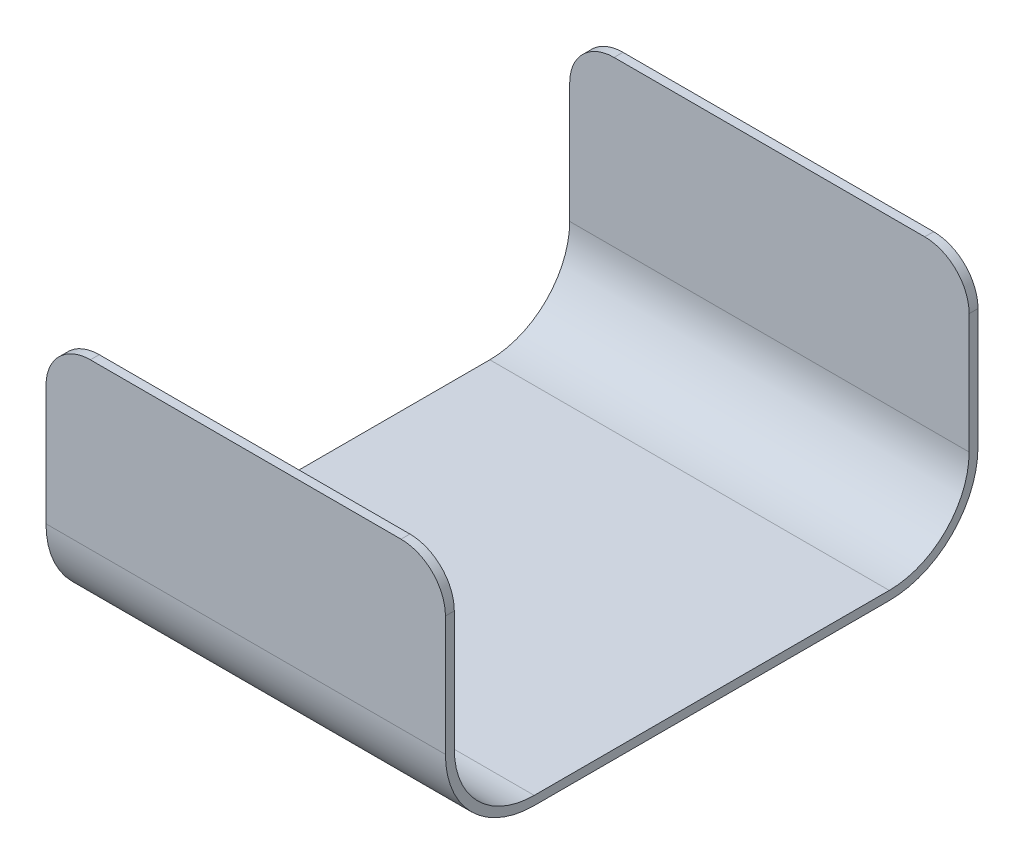
ISO-10303-21;
HEADER;
FILE_DESCRIPTION(('STEP AP214'),'2;1');
FILE_NAME('part.step','',(''),(''),'','','');
FILE_SCHEMA(('AUTOMOTIVE_DESIGN { 1 0 10303 214 1 1 1 1 }'));
ENDSEC;
DATA;
#1=APPLICATION_CONTEXT('core data for automotive mechanical design processes');
#2=APPLICATION_PROTOCOL_DEFINITION('international standard','automotive_design',2000,#1);
#3=PRODUCT_CONTEXT('',#1,'mechanical');
#4=PRODUCT('Part','Part','',(#3));
#5=PRODUCT_RELATED_PRODUCT_CATEGORY('part','',(#4));
#6=PRODUCT_DEFINITION_FORMATION('','',#4);
#7=PRODUCT_DEFINITION_CONTEXT('part definition',#1,'design');
#8=PRODUCT_DEFINITION('design','',#6,#7);
#9=PRODUCT_DEFINITION_SHAPE('','',#8);
#10=(LENGTH_UNIT() NAMED_UNIT(*) SI_UNIT(.MILLI.,.METRE.));
#11=(NAMED_UNIT(*) PLANE_ANGLE_UNIT() SI_UNIT($,.RADIAN.));
#12=(NAMED_UNIT(*) SI_UNIT($,.STERADIAN.) SOLID_ANGLE_UNIT());
#13=UNCERTAINTY_MEASURE_WITH_UNIT(LENGTH_MEASURE(1.E-05),#10,'distance_accuracy_value','');
#14=(GEOMETRIC_REPRESENTATION_CONTEXT(3) GLOBAL_UNCERTAINTY_ASSIGNED_CONTEXT((#13)) GLOBAL_UNIT_ASSIGNED_CONTEXT((#10,
#11,#12)) REPRESENTATION_CONTEXT('',''));
#15=CARTESIAN_POINT('',(0.,0.,0.));
#16=DIRECTION('',(0.,0.,1.));
#17=DIRECTION('',(1.,0.,0.));
#18=AXIS2_PLACEMENT_3D('',#15,#16,#17);
#19=CARTESIAN_POINT('',(-45.,28.5,60.));
#20=DIRECTION('',(0.,-1.,0.));
#21=DIRECTION('',(0.,0.,-1.));
#22=AXIS2_PLACEMENT_3D('',#19,#20,#21);
#23=PLANE('',#22);
#24=DIRECTION('',(-1.,0.,0.));
#25=VECTOR('',#24,1.);
#26=CARTESIAN_POINT('',(0.,28.5,-58.));
#27=LINE('',#26,#25);
#28=CARTESIAN_POINT('',(35.,28.5,-58.));
#29=VERTEX_POINT('',#28);
#30=CARTESIAN_POINT('',(-35.,28.5,-58.));
#31=VERTEX_POINT('',#30);
#32=EDGE_CURVE('E194',#29,#31,#27,.T.);
#33=ORIENTED_EDGE('',*,*,#32,.F.);
#34=DIRECTION('',(0.,0.,-1.));
#35=VECTOR('',#34,1.);
#36=CARTESIAN_POINT('',(35.,28.5,60.));
#37=LINE('',#36,#35);
#38=CARTESIAN_POINT('',(35.,28.5,-60.));
#39=VERTEX_POINT('',#38);
#40=EDGE_CURVE('E240',#29,#39,#37,.T.);
#41=ORIENTED_EDGE('',*,*,#40,.T.);
#42=DIRECTION('',(-1.,0.,0.));
#43=VECTOR('',#42,1.);
#44=CARTESIAN_POINT('',(-45.,28.5,-60.));
#45=LINE('',#44,#43);
#46=CARTESIAN_POINT('',(-35.,28.5,-60.));
#47=VERTEX_POINT('',#46);
#48=EDGE_CURVE('E209',#39,#47,#45,.T.);
#49=ORIENTED_EDGE('',*,*,#48,.T.);
#50=DIRECTION('',(0.,0.,-1.));
#51=VECTOR('',#50,1.);
#52=CARTESIAN_POINT('',(-35.,28.5,60.));
#53=LINE('',#52,#51);
#54=EDGE_CURVE('E238',#47,#31,#53,.F.);
#55=ORIENTED_EDGE('',*,*,#54,.T.);
#56=EDGE_LOOP('',(#33,#41,#49,#55));
#57=FACE_BOUND('',#56,.T.);
#58=ADVANCED_FACE('F32',(#57),#23,.F.);
#59=CARTESIAN_POINT('',(-45.,-28.5,60.));
#60=DIRECTION('',(1.,0.,0.));
#61=DIRECTION('',(0.,0.,-1.));
#62=AXIS2_PLACEMENT_3D('',#59,#60,#61);
#63=PLANE('',#62);
#64=DIRECTION('',(0.,-1.,0.));
#65=VECTOR('',#64,1.);
#66=CARTESIAN_POINT('',(-45.,0.,-58.));
#67=LINE('',#66,#65);
#68=CARTESIAN_POINT('',(-45.,18.5,-58.));
#69=VERTEX_POINT('',#68);
#70=CARTESIAN_POINT('',(-45.,-8.50000000000001,-58.));
#71=VERTEX_POINT('',#70);
#72=EDGE_CURVE('E187',#69,#71,#67,.T.);
#73=ORIENTED_EDGE('',*,*,#72,.F.);
#74=DIRECTION('',(0.,0.,-1.));
#75=VECTOR('',#74,1.);
#76=CARTESIAN_POINT('',(-45.,18.5,60.));
#77=LINE('',#76,#75);
#78=CARTESIAN_POINT('',(-45.,18.5,-60.));
#79=VERTEX_POINT('',#78);
#80=EDGE_CURVE('E257',#69,#79,#77,.T.);
#81=ORIENTED_EDGE('',*,*,#80,.T.);
#82=DIRECTION('',(0.,-1.,0.));
#83=VECTOR('',#82,1.);
#84=CARTESIAN_POINT('',(-45.,-28.5,-60.));
#85=LINE('',#84,#83);
#86=CARTESIAN_POINT('',(-45.,-8.50000000000001,-60.));
#87=VERTEX_POINT('',#86);
#88=EDGE_CURVE('E201',#79,#87,#85,.T.);
#89=ORIENTED_EDGE('',*,*,#88,.T.);
#90=CARTESIAN_POINT('',(-45.,-8.5,-40.));
#91=DIRECTION('',(1.,0.,0.));
#92=DIRECTION('',(0.,0.,-1.));
#93=AXIS2_PLACEMENT_3D('',#90,#91,#92);
#94=CIRCLE('',#93,20.);
#95=CARTESIAN_POINT('',(-45.,-28.5,-40.));
#96=VERTEX_POINT('',#95);
#97=EDGE_CURVE('E233',#87,#96,#94,.F.);
#98=ORIENTED_EDGE('',*,*,#97,.T.);
#99=DIRECTION('',(0.,0.,-1.));
#100=VECTOR('',#99,1.);
#101=CARTESIAN_POINT('',(-45.,-28.5,60.));
#102=LINE('',#101,#100);
#103=CARTESIAN_POINT('',(-45.,-28.5,40.));
#104=VERTEX_POINT('',#103);
#105=EDGE_CURVE('E215',#104,#96,#102,.T.);
#106=ORIENTED_EDGE('',*,*,#105,.F.);
#107=CARTESIAN_POINT('',(-45.,-8.5,40.));
#108=DIRECTION('',(1.,0.,0.));
#109=DIRECTION('',(0.,0.,-1.));
#110=AXIS2_PLACEMENT_3D('',#107,#108,#109);
#111=CIRCLE('',#110,20.);
#112=CARTESIAN_POINT('',(-45.,-8.50000000000001,60.));
#113=VERTEX_POINT('',#112);
#114=EDGE_CURVE('E230',#104,#113,#111,.F.);
#115=ORIENTED_EDGE('',*,*,#114,.T.);
#116=DIRECTION('',(0.,-1.,0.));
#117=VECTOR('',#116,1.);
#118=CARTESIAN_POINT('',(-45.,-28.5,60.));
#119=LINE('',#118,#117);
#120=CARTESIAN_POINT('',(-45.,18.5,60.));
#121=VERTEX_POINT('',#120);
#122=EDGE_CURVE('E203',#121,#113,#119,.T.);
#123=ORIENTED_EDGE('',*,*,#122,.F.);
#124=DIRECTION('',(0.,0.,-1.));
#125=VECTOR('',#124,1.);
#126=CARTESIAN_POINT('',(-45.,18.5,60.));
#127=LINE('',#126,#125);
#128=CARTESIAN_POINT('',(-45.,18.5,58.));
#129=VERTEX_POINT('',#128);
#130=EDGE_CURVE('E255',#121,#129,#127,.T.);
#131=ORIENTED_EDGE('',*,*,#130,.T.);
#132=DIRECTION('',(0.,-1.,0.));
#133=VECTOR('',#132,1.);
#134=CARTESIAN_POINT('',(-45.,0.,58.));
#135=LINE('',#134,#133);
#136=CARTESIAN_POINT('',(-45.,-8.50000000000001,58.));
#137=VERTEX_POINT('',#136);
#138=EDGE_CURVE('E169',#129,#137,#135,.T.);
#139=ORIENTED_EDGE('',*,*,#138,.T.);
#140=CARTESIAN_POINT('',(-45.,-8.5,40.));
#141=DIRECTION('',(1.,0.,0.));
#142=DIRECTION('',(0.,0.,-1.));
#143=AXIS2_PLACEMENT_3D('',#140,#141,#142);
#144=CIRCLE('',#143,18.);
#145=CARTESIAN_POINT('',(-45.,-26.5,40.));
#146=VERTEX_POINT('',#145);
#147=EDGE_CURVE('E149',#146,#137,#144,.F.);
#148=ORIENTED_EDGE('',*,*,#147,.F.);
#149=DIRECTION('',(0.,0.,-1.));
#150=VECTOR('',#149,1.);
#151=CARTESIAN_POINT('',(-45.,-26.5,60.));
#152=LINE('',#151,#150);
#153=CARTESIAN_POINT('',(-45.,-26.5,-40.));
#154=VERTEX_POINT('',#153);
#155=EDGE_CURVE('E156',#146,#154,#152,.T.);
#156=ORIENTED_EDGE('',*,*,#155,.T.);
#157=CARTESIAN_POINT('',(-45.,-8.5,-40.));
#158=DIRECTION('',(1.,0.,0.));
#159=DIRECTION('',(0.,0.,-1.));
#160=AXIS2_PLACEMENT_3D('',#157,#158,#159);
#161=CIRCLE('',#160,18.);
#162=EDGE_CURVE('E171',#71,#154,#161,.F.);
#163=ORIENTED_EDGE('',*,*,#162,.F.);
#164=EDGE_LOOP('',(#73,#81,#89,#98,#106,#115,#123,#131,#139,#148,#156,#163));
#165=FACE_BOUND('',#164,.T.);
#166=ADVANCED_FACE('F166',(#165),#63,.F.);
#167=CARTESIAN_POINT('',(45.,-28.5,60.));
#168=DIRECTION('',(-1.,0.,0.));
#169=DIRECTION('',(0.,0.,1.));
#170=AXIS2_PLACEMENT_3D('',#167,#168,#169);
#171=PLANE('',#170);
#172=DIRECTION('',(0.,1.,0.));
#173=VECTOR('',#172,1.);
#174=CARTESIAN_POINT('',(45.,-28.5,-60.));
#175=LINE('',#174,#173);
#176=CARTESIAN_POINT('',(45.,-8.50000000000001,-60.));
#177=VERTEX_POINT('',#176);
#178=CARTESIAN_POINT('',(45.,18.5,-60.));
#179=VERTEX_POINT('',#178);
#180=EDGE_CURVE('E206',#177,#179,#175,.T.);
#181=ORIENTED_EDGE('',*,*,#180,.T.);
#182=DIRECTION('',(0.,0.,-1.));
#183=VECTOR('',#182,1.);
#184=CARTESIAN_POINT('',(45.,18.5,60.));
#185=LINE('',#184,#183);
#186=CARTESIAN_POINT('',(45.,18.5,-58.));
#187=VERTEX_POINT('',#186);
#188=EDGE_CURVE('E249',#179,#187,#185,.F.);
#189=ORIENTED_EDGE('',*,*,#188,.T.);
#190=DIRECTION('',(0.,1.,0.));
#191=VECTOR('',#190,1.);
#192=CARTESIAN_POINT('',(45.,0.,-58.));
#193=LINE('',#192,#191);
#194=CARTESIAN_POINT('',(45.,-8.50000000000001,-58.));
#195=VERTEX_POINT('',#194);
#196=EDGE_CURVE('E191',#195,#187,#193,.T.);
#197=ORIENTED_EDGE('',*,*,#196,.F.);
#198=CARTESIAN_POINT('',(45.,-8.5,-40.));
#199=DIRECTION('',(-1.,0.,0.));
#200=DIRECTION('',(0.,0.,1.));
#201=AXIS2_PLACEMENT_3D('',#198,#199,#200);
#202=CIRCLE('',#201,18.);
#203=CARTESIAN_POINT('',(45.,-26.5,-40.));
#204=VERTEX_POINT('',#203);
#205=EDGE_CURVE('E177',#204,#195,#202,.F.);
#206=ORIENTED_EDGE('',*,*,#205,.F.);
#207=DIRECTION('',(0.,0.,-1.));
#208=VECTOR('',#207,1.);
#209=CARTESIAN_POINT('',(45.,-26.5,60.));
#210=LINE('',#209,#208);
#211=CARTESIAN_POINT('',(45.,-26.5,40.));
#212=VERTEX_POINT('',#211);
#213=EDGE_CURVE('E163',#212,#204,#210,.T.);
#214=ORIENTED_EDGE('',*,*,#213,.F.);
#215=CARTESIAN_POINT('',(45.,-8.5,40.));
#216=DIRECTION('',(-1.,0.,0.));
#217=DIRECTION('',(0.,0.,1.));
#218=AXIS2_PLACEMENT_3D('',#215,#216,#217);
#219=CIRCLE('',#218,18.);
#220=CARTESIAN_POINT('',(45.,-8.50000000000001,58.));
#221=VERTEX_POINT('',#220);
#222=EDGE_CURVE('E151',#221,#212,#219,.F.);
#223=ORIENTED_EDGE('',*,*,#222,.F.);
#224=DIRECTION('',(0.,1.,0.));
#225=VECTOR('',#224,1.);
#226=CARTESIAN_POINT('',(45.,0.,58.));
#227=LINE('',#226,#225);
#228=CARTESIAN_POINT('',(45.,18.5,58.));
#229=VERTEX_POINT('',#228);
#230=EDGE_CURVE('E184',#221,#229,#227,.T.);
#231=ORIENTED_EDGE('',*,*,#230,.T.);
#232=DIRECTION('',(0.,0.,-1.));
#233=VECTOR('',#232,1.);
#234=CARTESIAN_POINT('',(45.,18.5,60.));
#235=LINE('',#234,#233);
#236=CARTESIAN_POINT('',(45.,18.5,60.));
#237=VERTEX_POINT('',#236);
#238=EDGE_CURVE('E247',#229,#237,#235,.F.);
#239=ORIENTED_EDGE('',*,*,#238,.T.);
#240=DIRECTION('',(0.,1.,0.));
#241=VECTOR('',#240,1.);
#242=CARTESIAN_POINT('',(45.,-28.5,60.));
#243=LINE('',#242,#241);
#244=CARTESIAN_POINT('',(45.,-8.50000000000001,60.));
#245=VERTEX_POINT('',#244);
#246=EDGE_CURVE('E198',#245,#237,#243,.T.);
#247=ORIENTED_EDGE('',*,*,#246,.F.);
#248=CARTESIAN_POINT('',(45.,-8.5,40.));
#249=DIRECTION('',(-1.,0.,0.));
#250=DIRECTION('',(0.,0.,1.));
#251=AXIS2_PLACEMENT_3D('',#248,#249,#250);
#252=CIRCLE('',#251,20.);
#253=CARTESIAN_POINT('',(45.,-28.5,40.));
#254=VERTEX_POINT('',#253);
#255=EDGE_CURVE('E223',#245,#254,#252,.F.);
#256=ORIENTED_EDGE('',*,*,#255,.T.);
#257=DIRECTION('',(0.,0.,-1.));
#258=VECTOR('',#257,1.);
#259=CARTESIAN_POINT('',(45.,-28.5,60.));
#260=LINE('',#259,#258);
#261=CARTESIAN_POINT('',(45.,-28.5,-40.));
#262=VERTEX_POINT('',#261);
#263=EDGE_CURVE('E205',#254,#262,#260,.T.);
#264=ORIENTED_EDGE('',*,*,#263,.T.);
#265=CARTESIAN_POINT('',(45.,-8.5,-40.));
#266=DIRECTION('',(-1.,0.,0.));
#267=DIRECTION('',(0.,0.,1.));
#268=AXIS2_PLACEMENT_3D('',#265,#266,#267);
#269=CIRCLE('',#268,20.);
#270=EDGE_CURVE('E225',#262,#177,#269,.F.);
#271=ORIENTED_EDGE('',*,*,#270,.T.);
#272=EDGE_LOOP('',(#181,#189,#197,#206,#214,#223,#231,#239,#247,#256,#264,#271));
#273=FACE_BOUND('',#272,.T.);
#274=ADVANCED_FACE('F285',(#273),#171,.F.);
#275=DIRECTION('',(-1.,0.,0.));
#276=VECTOR('',#275,1.);
#277=CARTESIAN_POINT('',(-45.,28.5,60.));
#278=LINE('',#277,#276);
#279=CARTESIAN_POINT('',(35.,28.5,60.));
#280=VERTEX_POINT('',#279);
#281=CARTESIAN_POINT('',(-35.,28.5,60.));
#282=VERTEX_POINT('',#281);
#283=EDGE_CURVE('E200',#280,#282,#278,.T.);
#284=ORIENTED_EDGE('',*,*,#283,.F.);
#285=DIRECTION('',(0.,0.,-1.));
#286=VECTOR('',#285,1.);
#287=CARTESIAN_POINT('',(35.,28.5,60.));
#288=LINE('',#287,#286);
#289=CARTESIAN_POINT('',(35.,28.5,58.));
#290=VERTEX_POINT('',#289);
#291=EDGE_CURVE('E261',#280,#290,#288,.T.);
#292=ORIENTED_EDGE('',*,*,#291,.T.);
#293=DIRECTION('',(-1.,0.,0.));
#294=VECTOR('',#293,1.);
#295=CARTESIAN_POINT('',(0.,28.5,58.));
#296=LINE('',#295,#294);
#297=CARTESIAN_POINT('',(-35.,28.5,58.));
#298=VERTEX_POINT('',#297);
#299=EDGE_CURVE('E182',#290,#298,#296,.T.);
#300=ORIENTED_EDGE('',*,*,#299,.T.);
#301=DIRECTION('',(0.,0.,-1.));
#302=VECTOR('',#301,1.);
#303=CARTESIAN_POINT('',(-35.,28.5,60.));
#304=LINE('',#303,#302);
#305=EDGE_CURVE('E47',#298,#282,#304,.F.);
#306=ORIENTED_EDGE('',*,*,#305,.T.);
#307=EDGE_LOOP('',(#284,#292,#300,#306));
#308=FACE_BOUND('',#307,.T.);
#309=ADVANCED_FACE('F278',(#308),#23,.F.);
#310=CARTESIAN_POINT('',(-45.,-28.5,60.));
#311=DIRECTION('',(0.,1.,0.));
#312=DIRECTION('',(0.,0.,1.));
#313=AXIS2_PLACEMENT_3D('',#310,#311,#312);
#314=PLANE('',#313);
#315=ORIENTED_EDGE('',*,*,#105,.T.);
#316=DIRECTION('',(1.,0.,0.));
#317=VECTOR('',#316,1.);
#318=CARTESIAN_POINT('',(45.,-28.5,-40.));
#319=LINE('',#318,#317);
#320=EDGE_CURVE('E220',#96,#262,#319,.T.);
#321=ORIENTED_EDGE('',*,*,#320,.T.);
#322=ORIENTED_EDGE('',*,*,#263,.F.);
#323=DIRECTION('',(1.,0.,0.));
#324=VECTOR('',#323,1.);
#325=CARTESIAN_POINT('',(-45.,-28.5,40.));
#326=LINE('',#325,#324);
#327=EDGE_CURVE('E218',#254,#104,#326,.F.);
#328=ORIENTED_EDGE('',*,*,#327,.T.);
#329=EDGE_LOOP('',(#315,#321,#322,#328));
#330=FACE_BOUND('',#329,.T.);
#331=ADVANCED_FACE('F318',(#330),#314,.F.);
#332=CARTESIAN_POINT('',(0.,0.,60.));
#333=DIRECTION('',(0.,0.,-1.));
#334=DIRECTION('',(-1.,0.,0.));
#335=AXIS2_PLACEMENT_3D('',#332,#333,#334);
#336=PLANE('',#335);
#337=ORIENTED_EDGE('',*,*,#246,.T.);
#338=CARTESIAN_POINT('',(35.,18.5,60.));
#339=DIRECTION('',(0.,0.,-1.));
#340=DIRECTION('',(-1.,0.,0.));
#341=AXIS2_PLACEMENT_3D('',#338,#339,#340);
#342=CIRCLE('',#341,10.);
#343=EDGE_CURVE('E11',#237,#280,#342,.F.);
#344=ORIENTED_EDGE('',*,*,#343,.T.);
#345=ORIENTED_EDGE('',*,*,#283,.T.);
#346=CARTESIAN_POINT('',(-35.,18.5,60.));
#347=DIRECTION('',(0.,0.,-1.));
#348=DIRECTION('',(-1.,0.,0.));
#349=AXIS2_PLACEMENT_3D('',#346,#347,#348);
#350=CIRCLE('',#349,10.);
#351=EDGE_CURVE('E40',#282,#121,#350,.F.);
#352=ORIENTED_EDGE('',*,*,#351,.T.);
#353=ORIENTED_EDGE('',*,*,#122,.T.);
#354=DIRECTION('',(1.,0.,0.));
#355=VECTOR('',#354,1.);
#356=CARTESIAN_POINT('',(0.,-8.5,60.));
#357=LINE('',#356,#355);
#358=EDGE_CURVE('E235',#113,#245,#357,.T.);
#359=ORIENTED_EDGE('',*,*,#358,.T.);
#360=EDGE_LOOP('',(#337,#344,#345,#352,#353,#359));
#361=FACE_BOUND('',#360,.T.);
#362=ADVANCED_FACE('F269',(#361),#336,.F.);
#363=CARTESIAN_POINT('',(0.,0.,-60.));
#364=DIRECTION('',(0.,0.,-1.));
#365=DIRECTION('',(-1.,0.,0.));
#366=AXIS2_PLACEMENT_3D('',#363,#364,#365);
#367=PLANE('',#366);
#368=ORIENTED_EDGE('',*,*,#48,.F.);
#369=CARTESIAN_POINT('',(35.,18.5,-60.));
#370=DIRECTION('',(0.,0.,-1.));
#371=DIRECTION('',(-1.,0.,0.));
#372=AXIS2_PLACEMENT_3D('',#369,#370,#371);
#373=CIRCLE('',#372,10.);
#374=EDGE_CURVE('E245',#39,#179,#373,.T.);
#375=ORIENTED_EDGE('',*,*,#374,.T.);
#376=ORIENTED_EDGE('',*,*,#180,.F.);
#377=DIRECTION('',(1.,0.,0.));
#378=VECTOR('',#377,1.);
#379=CARTESIAN_POINT('',(-45.,-8.5,-60.));
#380=LINE('',#379,#378);
#381=EDGE_CURVE('E227',#177,#87,#380,.F.);
#382=ORIENTED_EDGE('',*,*,#381,.T.);
#383=ORIENTED_EDGE('',*,*,#88,.F.);
#384=CARTESIAN_POINT('',(-35.,18.5,-60.));
#385=DIRECTION('',(0.,0.,-1.));
#386=DIRECTION('',(-1.,0.,0.));
#387=AXIS2_PLACEMENT_3D('',#384,#385,#386);
#388=CIRCLE('',#387,10.);
#389=EDGE_CURVE('E243',#79,#47,#388,.T.);
#390=ORIENTED_EDGE('',*,*,#389,.T.);
#391=EDGE_LOOP('',(#368,#375,#376,#382,#383,#390));
#392=FACE_BOUND('',#391,.T.);
#393=ADVANCED_FACE('F303',(#392),#367,.T.);
#394=CARTESIAN_POINT('',(-45.,-8.5,-40.));
#395=DIRECTION('',(-1.,0.,0.));
#396=DIRECTION('',(0.,0.,1.));
#397=AXIS2_PLACEMENT_3D('',#394,#395,#396);
#398=CYLINDRICAL_SURFACE('',#397,20.);
#399=ORIENTED_EDGE('',*,*,#97,.F.);
#400=ORIENTED_EDGE('',*,*,#381,.F.);
#401=ORIENTED_EDGE('',*,*,#270,.F.);
#402=ORIENTED_EDGE('',*,*,#320,.F.);
#403=EDGE_LOOP('',(#399,#400,#401,#402));
#404=FACE_BOUND('',#403,.T.);
#405=ADVANCED_FACE('F316',(#404),#398,.T.);
#406=CARTESIAN_POINT('',(0.,-8.5,40.));
#407=DIRECTION('',(1.,0.,0.));
#408=DIRECTION('',(0.,0.,-1.));
#409=AXIS2_PLACEMENT_3D('',#406,#407,#408);
#410=CYLINDRICAL_SURFACE('',#409,20.);
#411=ORIENTED_EDGE('',*,*,#114,.F.);
#412=ORIENTED_EDGE('',*,*,#327,.F.);
#413=ORIENTED_EDGE('',*,*,#255,.F.);
#414=ORIENTED_EDGE('',*,*,#358,.F.);
#415=EDGE_LOOP('',(#411,#412,#413,#414));
#416=FACE_BOUND('',#415,.T.);
#417=ADVANCED_FACE('F321',(#416),#410,.T.);
#418=CARTESIAN_POINT('',(-45.,-26.5,60.));
#419=DIRECTION('',(0.,1.,0.));
#420=DIRECTION('',(0.,0.,1.));
#421=AXIS2_PLACEMENT_3D('',#418,#419,#420);
#422=PLANE('',#421);
#423=ORIENTED_EDGE('',*,*,#155,.F.);
#424=DIRECTION('',(1.,0.,0.));
#425=VECTOR('',#424,1.);
#426=CARTESIAN_POINT('',(-45.,-26.5,40.));
#427=LINE('',#426,#425);
#428=EDGE_CURVE('E145',#212,#146,#427,.F.);
#429=ORIENTED_EDGE('',*,*,#428,.F.);
#430=ORIENTED_EDGE('',*,*,#213,.T.);
#431=DIRECTION('',(1.,0.,0.));
#432=VECTOR('',#431,1.);
#433=CARTESIAN_POINT('',(-45.,-26.5,-40.));
#434=LINE('',#433,#432);
#435=EDGE_CURVE('E155',#154,#204,#434,.T.);
#436=ORIENTED_EDGE('',*,*,#435,.F.);
#437=EDGE_LOOP('',(#423,#429,#430,#436));
#438=FACE_BOUND('',#437,.T.);
#439=ADVANCED_FACE('F160',(#438),#422,.T.);
#440=CARTESIAN_POINT('',(0.,0.,58.));
#441=DIRECTION('',(0.,0.,-1.));
#442=DIRECTION('',(-1.,0.,0.));
#443=AXIS2_PLACEMENT_3D('',#440,#441,#442);
#444=PLANE('',#443);
#445=ORIENTED_EDGE('',*,*,#299,.F.);
#446=CARTESIAN_POINT('',(35.,18.5,58.));
#447=DIRECTION('',(0.,0.,-1.));
#448=DIRECTION('',(-1.,0.,0.));
#449=AXIS2_PLACEMENT_3D('',#446,#447,#448);
#450=CIRCLE('',#449,10.);
#451=EDGE_CURVE('E266',#290,#229,#450,.T.);
#452=ORIENTED_EDGE('',*,*,#451,.T.);
#453=ORIENTED_EDGE('',*,*,#230,.F.);
#454=DIRECTION('',(-1.,0.,0.));
#455=VECTOR('',#454,1.);
#456=CARTESIAN_POINT('',(0.,-8.50000000000001,58.));
#457=LINE('',#456,#455);
#458=EDGE_CURVE('E174',#137,#221,#457,.F.);
#459=ORIENTED_EDGE('',*,*,#458,.F.);
#460=ORIENTED_EDGE('',*,*,#138,.F.);
#461=CARTESIAN_POINT('',(-35.,18.5,58.));
#462=DIRECTION('',(0.,0.,-1.));
#463=DIRECTION('',(-1.,0.,0.));
#464=AXIS2_PLACEMENT_3D('',#461,#462,#463);
#465=CIRCLE('',#464,10.);
#466=EDGE_CURVE('E264',#129,#298,#465,.T.);
#467=ORIENTED_EDGE('',*,*,#466,.T.);
#468=EDGE_LOOP('',(#445,#452,#453,#459,#460,#467));
#469=FACE_BOUND('',#468,.T.);
#470=ADVANCED_FACE('F277',(#469),#444,.T.);
#471=CARTESIAN_POINT('',(0.,0.,-58.));
#472=DIRECTION('',(0.,0.,-1.));
#473=DIRECTION('',(-1.,0.,0.));
#474=AXIS2_PLACEMENT_3D('',#471,#472,#473);
#475=PLANE('',#474);
#476=ORIENTED_EDGE('',*,*,#196,.T.);
#477=CARTESIAN_POINT('',(35.,18.5,-58.));
#478=DIRECTION('',(0.,0.,-1.));
#479=DIRECTION('',(-1.,0.,0.));
#480=AXIS2_PLACEMENT_3D('',#477,#478,#479);
#481=CIRCLE('',#480,10.);
#482=EDGE_CURVE('E253',#187,#29,#481,.F.);
#483=ORIENTED_EDGE('',*,*,#482,.T.);
#484=ORIENTED_EDGE('',*,*,#32,.T.);
#485=CARTESIAN_POINT('',(-35.,18.5,-58.));
#486=DIRECTION('',(0.,0.,-1.));
#487=DIRECTION('',(-1.,0.,0.));
#488=AXIS2_PLACEMENT_3D('',#485,#486,#487);
#489=CIRCLE('',#488,10.);
#490=EDGE_CURVE('E251',#31,#69,#489,.F.);
#491=ORIENTED_EDGE('',*,*,#490,.T.);
#492=ORIENTED_EDGE('',*,*,#72,.T.);
#493=DIRECTION('',(-1.,0.,0.));
#494=VECTOR('',#493,1.);
#495=CARTESIAN_POINT('',(0.,-8.50000000000001,-58.));
#496=LINE('',#495,#494);
#497=EDGE_CURVE('E172',#195,#71,#496,.T.);
#498=ORIENTED_EDGE('',*,*,#497,.F.);
#499=EDGE_LOOP('',(#476,#483,#484,#491,#492,#498));
#500=FACE_BOUND('',#499,.T.);
#501=ADVANCED_FACE('F293',(#500),#475,.F.);
#502=CARTESIAN_POINT('',(-45.,-8.5,-40.));
#503=DIRECTION('',(-1.,0.,0.));
#504=DIRECTION('',(0.,0.,1.));
#505=AXIS2_PLACEMENT_3D('',#502,#503,#504);
#506=CYLINDRICAL_SURFACE('',#505,18.);
#507=ORIENTED_EDGE('',*,*,#162,.T.);
#508=ORIENTED_EDGE('',*,*,#435,.T.);
#509=ORIENTED_EDGE('',*,*,#205,.T.);
#510=ORIENTED_EDGE('',*,*,#497,.T.);
#511=EDGE_LOOP('',(#507,#508,#509,#510));
#512=FACE_BOUND('',#511,.T.);
#513=ADVANCED_FACE('F291',(#512),#506,.F.);
#514=CARTESIAN_POINT('',(0.,-8.5,40.));
#515=DIRECTION('',(1.,0.,0.));
#516=DIRECTION('',(0.,0.,-1.));
#517=AXIS2_PLACEMENT_3D('',#514,#515,#516);
#518=CYLINDRICAL_SURFACE('',#517,18.);
#519=ORIENTED_EDGE('',*,*,#147,.T.);
#520=ORIENTED_EDGE('',*,*,#458,.T.);
#521=ORIENTED_EDGE('',*,*,#222,.T.);
#522=ORIENTED_EDGE('',*,*,#428,.T.);
#523=EDGE_LOOP('',(#519,#520,#521,#522));
#524=FACE_BOUND('',#523,.T.);
#525=ADVANCED_FACE('F147',(#524),#518,.F.);
#526=CARTESIAN_POINT('',(35.,18.5,60.));
#527=DIRECTION('',(0.,0.,-1.));
#528=DIRECTION('',(-1.,0.,0.));
#529=AXIS2_PLACEMENT_3D('',#526,#527,#528);
#530=CYLINDRICAL_SURFACE('',#529,10.);
#531=ORIENTED_EDGE('',*,*,#482,.F.);
#532=ORIENTED_EDGE('',*,*,#188,.F.);
#533=ORIENTED_EDGE('',*,*,#374,.F.);
#534=ORIENTED_EDGE('',*,*,#40,.F.);
#535=EDGE_LOOP('',(#531,#532,#533,#534));
#536=FACE_BOUND('',#535,.T.);
#537=ADVANCED_FACE('F308',(#536),#530,.T.);
#538=CARTESIAN_POINT('',(-35.,18.5,60.));
#539=DIRECTION('',(0.,0.,-1.));
#540=DIRECTION('',(-1.,0.,0.));
#541=AXIS2_PLACEMENT_3D('',#538,#539,#540);
#542=CYLINDRICAL_SURFACE('',#541,10.);
#543=ORIENTED_EDGE('',*,*,#490,.F.);
#544=ORIENTED_EDGE('',*,*,#54,.F.);
#545=ORIENTED_EDGE('',*,*,#389,.F.);
#546=ORIENTED_EDGE('',*,*,#80,.F.);
#547=EDGE_LOOP('',(#543,#544,#545,#546));
#548=FACE_BOUND('',#547,.T.);
#549=ADVANCED_FACE('F299',(#548),#542,.T.);
#550=CARTESIAN_POINT('',(35.,18.5,60.));
#551=DIRECTION('',(0.,0.,-1.));
#552=DIRECTION('',(-1.,0.,0.));
#553=AXIS2_PLACEMENT_3D('',#550,#551,#552);
#554=CYLINDRICAL_SURFACE('',#553,10.);
#555=ORIENTED_EDGE('',*,*,#343,.F.);
#556=ORIENTED_EDGE('',*,*,#238,.F.);
#557=ORIENTED_EDGE('',*,*,#451,.F.);
#558=ORIENTED_EDGE('',*,*,#291,.F.);
#559=EDGE_LOOP('',(#555,#556,#557,#558));
#560=FACE_BOUND('',#559,.T.);
#561=ADVANCED_FACE('F281',(#560),#554,.T.);
#562=CARTESIAN_POINT('',(-35.,18.5,60.));
#563=DIRECTION('',(0.,0.,-1.));
#564=DIRECTION('',(-1.,0.,0.));
#565=AXIS2_PLACEMENT_3D('',#562,#563,#564);
#566=CYLINDRICAL_SURFACE('',#565,10.);
#567=ORIENTED_EDGE('',*,*,#351,.F.);
#568=ORIENTED_EDGE('',*,*,#305,.F.);
#569=ORIENTED_EDGE('',*,*,#466,.F.);
#570=ORIENTED_EDGE('',*,*,#130,.F.);
#571=EDGE_LOOP('',(#567,#568,#569,#570));
#572=FACE_BOUND('',#571,.T.);
#573=ADVANCED_FACE('F34',(#572),#566,.T.);
#574=CLOSED_SHELL('',(#58,#166,#274,#309,#331,#362,#393,#405,#417,#439,#470,#501,#513,#525,#537,
#549,#561,#573));
#575=MANIFOLD_SOLID_BREP('B2',#574);
#576=ADVANCED_BREP_SHAPE_REPRESENTATION('',(#18,#575),#14);
#577=SHAPE_DEFINITION_REPRESENTATION(#9,#576);
ENDSEC;
END-ISO-10303-21;
